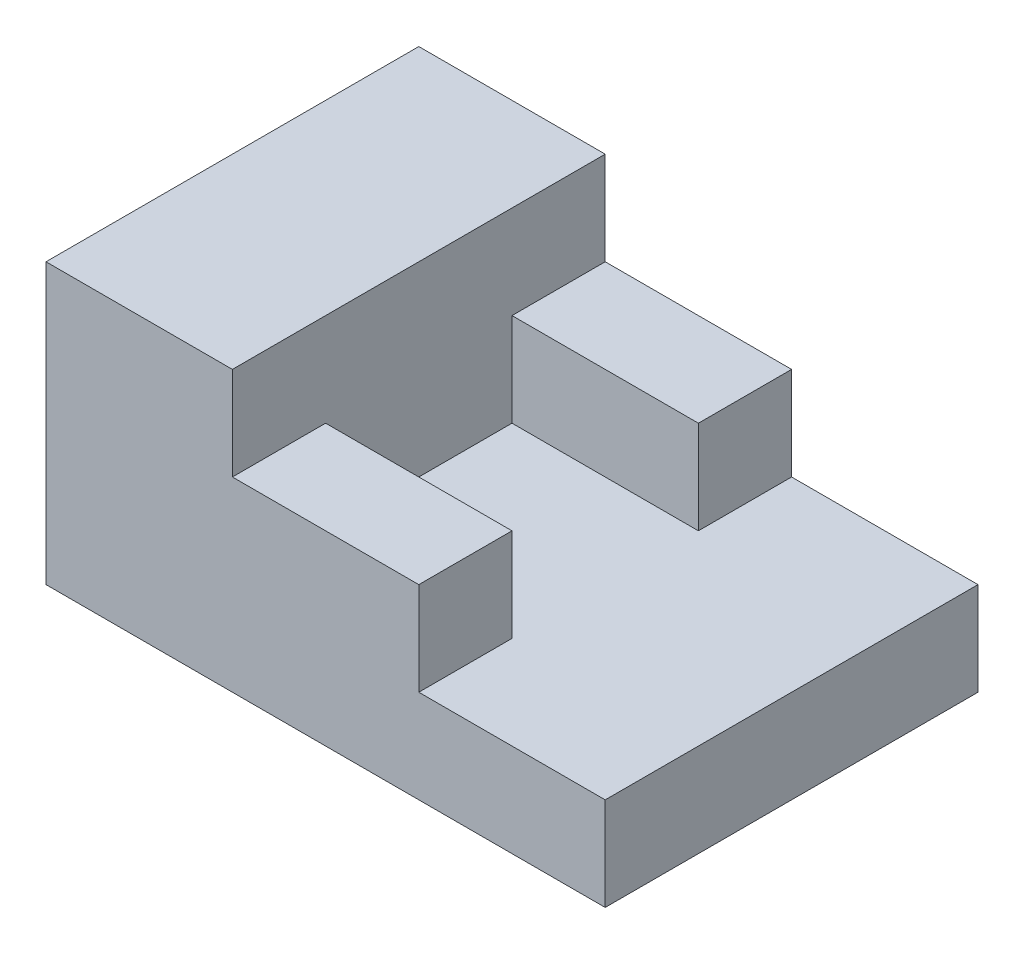
ISO-10303-21;
HEADER;
FILE_DESCRIPTION(('STEP AP214'),'2;1');
FILE_NAME('part.step','',(''),(''),'','','');
FILE_SCHEMA(('AUTOMOTIVE_DESIGN { 1 0 10303 214 1 1 1 1 }'));
ENDSEC;
DATA;
#1=APPLICATION_CONTEXT('core data for automotive mechanical design processes');
#2=APPLICATION_PROTOCOL_DEFINITION('international standard','automotive_design',2000,#1);
#3=PRODUCT_CONTEXT('',#1,'mechanical');
#4=PRODUCT('Part','Part','',(#3));
#5=PRODUCT_RELATED_PRODUCT_CATEGORY('part','',(#4));
#6=PRODUCT_DEFINITION_FORMATION('','',#4);
#7=PRODUCT_DEFINITION_CONTEXT('part definition',#1,'design');
#8=PRODUCT_DEFINITION('design','',#6,#7);
#9=PRODUCT_DEFINITION_SHAPE('','',#8);
#10=(LENGTH_UNIT() NAMED_UNIT(*) SI_UNIT(.MILLI.,.METRE.));
#11=(NAMED_UNIT(*) PLANE_ANGLE_UNIT() SI_UNIT($,.RADIAN.));
#12=(NAMED_UNIT(*) SI_UNIT($,.STERADIAN.) SOLID_ANGLE_UNIT());
#13=UNCERTAINTY_MEASURE_WITH_UNIT(LENGTH_MEASURE(1.E-05),#10,'distance_accuracy_value','');
#14=(GEOMETRIC_REPRESENTATION_CONTEXT(3) GLOBAL_UNCERTAINTY_ASSIGNED_CONTEXT((#13)) GLOBAL_UNIT_ASSIGNED_CONTEXT((#10,
#11,#12)) REPRESENTATION_CONTEXT('',''));
#15=CARTESIAN_POINT('',(0.,0.,0.));
#16=DIRECTION('',(0.,0.,1.));
#17=DIRECTION('',(1.,0.,0.));
#18=AXIS2_PLACEMENT_3D('',#15,#16,#17);
#19=CARTESIAN_POINT('',(2.71604938271606,-4.32098765432099,40.));
#20=DIRECTION('',(-1.,0.,0.));
#21=DIRECTION('',(0.,-1.,0.));
#22=AXIS2_PLACEMENT_3D('',#19,#20,#21);
#23=PLANE('',#22);
#24=DIRECTION('',(0.,1.,0.));
#25=VECTOR('',#24,1.);
#26=CARTESIAN_POINT('',(2.71604938271606,-4.32098765432099,30.));
#27=LINE('',#26,#25);
#28=CARTESIAN_POINT('',(2.71604938271606,-4.32098765432099,30.));
#29=VERTEX_POINT('',#28);
#30=CARTESIAN_POINT('',(2.71604938271606,5.67901234567901,30.));
#31=VERTEX_POINT('',#30);
#32=EDGE_CURVE('E138',#29,#31,#27,.T.);
#33=ORIENTED_EDGE('',*,*,#32,.T.);
#34=DIRECTION('',(0.,0.,-1.));
#35=VECTOR('',#34,1.);
#36=CARTESIAN_POINT('',(2.71604938271606,5.67901234567901,40.));
#37=LINE('',#36,#35);
#38=CARTESIAN_POINT('',(2.71604938271606,5.67901234567901,40.));
#39=VERTEX_POINT('',#38);
#40=EDGE_CURVE('E135',#39,#31,#37,.T.);
#41=ORIENTED_EDGE('',*,*,#40,.F.);
#42=DIRECTION('',(0.,1.,0.));
#43=VECTOR('',#42,1.);
#44=CARTESIAN_POINT('',(2.71604938271606,-4.32098765432099,40.));
#45=LINE('',#44,#43);
#46=CARTESIAN_POINT('',(2.71604938271606,-4.32098765432099,40.));
#47=VERTEX_POINT('',#46);
#48=EDGE_CURVE('E120',#47,#39,#45,.T.);
#49=ORIENTED_EDGE('',*,*,#48,.F.);
#50=DIRECTION('',(0.,0.,-1.));
#51=VECTOR('',#50,1.);
#52=CARTESIAN_POINT('',(2.71604938271606,-4.32098765432099,40.));
#53=LINE('',#52,#51);
#54=EDGE_CURVE('E188',#47,#29,#53,.T.);
#55=ORIENTED_EDGE('',*,*,#54,.T.);
#56=EDGE_LOOP('',(#33,#41,#49,#55));
#57=FACE_BOUND('',#56,.T.);
#58=ADVANCED_FACE('F39',(#57),#23,.F.);
#59=DIRECTION('',(0.,1.,0.));
#60=VECTOR('',#59,1.);
#61=CARTESIAN_POINT('',(2.71604938271606,-4.32098765432099,10.));
#62=LINE('',#61,#60);
#63=CARTESIAN_POINT('',(2.71604938271606,-4.32098765432099,10.));
#64=VERTEX_POINT('',#63);
#65=CARTESIAN_POINT('',(2.71604938271606,5.67901234567901,10.));
#66=VERTEX_POINT('',#65);
#67=EDGE_CURVE('E240',#64,#66,#62,.T.);
#68=ORIENTED_EDGE('',*,*,#67,.F.);
#69=CARTESIAN_POINT('',(2.71604938271606,-4.32098765432099,0.));
#70=VERTEX_POINT('',#69);
#71=EDGE_CURVE('E142',#64,#70,#53,.T.);
#72=ORIENTED_EDGE('',*,*,#71,.T.);
#73=DIRECTION('',(0.,1.,0.));
#74=VECTOR('',#73,1.);
#75=CARTESIAN_POINT('',(2.71604938271606,-4.32098765432099,0.));
#76=LINE('',#75,#74);
#77=CARTESIAN_POINT('',(2.71604938271606,5.67901234567901,0.));
#78=VERTEX_POINT('',#77);
#79=EDGE_CURVE('E172',#70,#78,#76,.T.);
#80=ORIENTED_EDGE('',*,*,#79,.T.);
#81=EDGE_CURVE('E143',#66,#78,#37,.T.);
#82=ORIENTED_EDGE('',*,*,#81,.F.);
#83=EDGE_LOOP('',(#68,#72,#80,#82));
#84=FACE_BOUND('',#83,.T.);
#85=ADVANCED_FACE('F277',(#84),#23,.F.);
#86=CARTESIAN_POINT('',(2.71604938271606,5.67901234567901,40.));
#87=DIRECTION('',(0.,-1.,0.));
#88=DIRECTION('',(1.,0.,0.));
#89=AXIS2_PLACEMENT_3D('',#86,#87,#88);
#90=PLANE('',#89);
#91=DIRECTION('',(-1.,0.,0.));
#92=VECTOR('',#91,1.);
#93=CARTESIAN_POINT('',(2.71604938271606,5.67901234567901,30.));
#94=LINE('',#93,#92);
#95=CARTESIAN_POINT('',(-17.2839506172839,5.67901234567901,30.));
#96=VERTEX_POINT('',#95);
#97=EDGE_CURVE('E247',#31,#96,#94,.T.);
#98=ORIENTED_EDGE('',*,*,#97,.T.);
#99=DIRECTION('',(0.,0.,-1.));
#100=VECTOR('',#99,1.);
#101=CARTESIAN_POINT('',(-17.2839506172839,5.67901234567901,40.));
#102=LINE('',#101,#100);
#103=CARTESIAN_POINT('',(-17.2839506172839,5.67901234567901,40.));
#104=VERTEX_POINT('',#103);
#105=EDGE_CURVE('E147',#104,#96,#102,.T.);
#106=ORIENTED_EDGE('',*,*,#105,.F.);
#107=DIRECTION('',(-1.,0.,0.));
#108=VECTOR('',#107,1.);
#109=CARTESIAN_POINT('',(2.71604938271606,5.67901234567901,40.));
#110=LINE('',#109,#108);
#111=EDGE_CURVE('E124',#39,#104,#110,.T.);
#112=ORIENTED_EDGE('',*,*,#111,.F.);
#113=ORIENTED_EDGE('',*,*,#40,.T.);
#114=EDGE_LOOP('',(#98,#106,#112,#113));
#115=FACE_BOUND('',#114,.T.);
#116=ADVANCED_FACE('F145',(#115),#90,.F.);
#117=DIRECTION('',(1.,0.,0.));
#118=VECTOR('',#117,1.);
#119=CARTESIAN_POINT('',(-17.2839506172839,5.67901234567901,10.));
#120=LINE('',#119,#118);
#121=CARTESIAN_POINT('',(-17.2839506172839,5.67901234567901,10.));
#122=VERTEX_POINT('',#121);
#123=EDGE_CURVE('E55',#122,#66,#120,.T.);
#124=ORIENTED_EDGE('',*,*,#123,.T.);
#125=ORIENTED_EDGE('',*,*,#81,.T.);
#126=DIRECTION('',(-1.,0.,0.));
#127=VECTOR('',#126,1.);
#128=CARTESIAN_POINT('',(2.71604938271606,5.67901234567901,0.));
#129=LINE('',#128,#127);
#130=CARTESIAN_POINT('',(-17.2839506172839,5.67901234567901,0.));
#131=VERTEX_POINT('',#130);
#132=EDGE_CURVE('E176',#78,#131,#129,.T.);
#133=ORIENTED_EDGE('',*,*,#132,.T.);
#134=EDGE_CURVE('E185',#122,#131,#102,.T.);
#135=ORIENTED_EDGE('',*,*,#134,.F.);
#136=EDGE_LOOP('',(#124,#125,#133,#135));
#137=FACE_BOUND('',#136,.T.);
#138=ADVANCED_FACE('F284',(#137),#90,.F.);
#139=CARTESIAN_POINT('',(-17.2839506172839,15.679012345679,40.));
#140=DIRECTION('',(0.,-1.,0.));
#141=DIRECTION('',(1.,0.,0.));
#142=AXIS2_PLACEMENT_3D('',#139,#140,#141);
#143=PLANE('',#142);
#144=DIRECTION('',(-1.,0.,0.));
#145=VECTOR('',#144,1.);
#146=CARTESIAN_POINT('',(-17.2839506172839,15.679012345679,0.));
#147=LINE('',#146,#145);
#148=CARTESIAN_POINT('',(-17.2839506172839,15.679012345679,0.));
#149=VERTEX_POINT('',#148);
#150=CARTESIAN_POINT('',(-37.2839506172839,15.679012345679,0.));
#151=VERTEX_POINT('',#150);
#152=EDGE_CURVE('E155',#149,#151,#147,.T.);
#153=ORIENTED_EDGE('',*,*,#152,.T.);
#154=DIRECTION('',(0.,0.,-1.));
#155=VECTOR('',#154,1.);
#156=CARTESIAN_POINT('',(-37.2839506172839,15.679012345679,40.));
#157=LINE('',#156,#155);
#158=CARTESIAN_POINT('',(-37.2839506172839,15.679012345679,40.));
#159=VERTEX_POINT('',#158);
#160=EDGE_CURVE('E11',#159,#151,#157,.T.);
#161=ORIENTED_EDGE('',*,*,#160,.F.);
#162=DIRECTION('',(-1.,0.,0.));
#163=VECTOR('',#162,1.);
#164=CARTESIAN_POINT('',(-17.2839506172839,15.679012345679,40.));
#165=LINE('',#164,#163);
#166=CARTESIAN_POINT('',(-17.2839506172839,15.679012345679,40.));
#167=VERTEX_POINT('',#166);
#168=EDGE_CURVE('E182',#167,#159,#165,.T.);
#169=ORIENTED_EDGE('',*,*,#168,.F.);
#170=DIRECTION('',(0.,0.,-1.));
#171=VECTOR('',#170,1.);
#172=CARTESIAN_POINT('',(-17.2839506172839,15.679012345679,40.));
#173=LINE('',#172,#171);
#174=EDGE_CURVE('E151',#167,#149,#173,.T.);
#175=ORIENTED_EDGE('',*,*,#174,.T.);
#176=EDGE_LOOP('',(#153,#161,#169,#175));
#177=FACE_BOUND('',#176,.T.);
#178=ADVANCED_FACE('F41',(#177),#143,.F.);
#179=CARTESIAN_POINT('',(-37.2839506172839,15.679012345679,40.));
#180=DIRECTION('',(1.,0.,0.));
#181=DIRECTION('',(0.,0.,-1.));
#182=AXIS2_PLACEMENT_3D('',#179,#180,#181);
#183=PLANE('',#182);
#184=DIRECTION('',(0.,-1.,0.));
#185=VECTOR('',#184,1.);
#186=CARTESIAN_POINT('',(-37.2839506172839,15.679012345679,0.));
#187=LINE('',#186,#185);
#188=CARTESIAN_POINT('',(-37.2839506172839,-14.320987654321,0.));
#189=VERTEX_POINT('',#188);
#190=EDGE_CURVE('E159',#151,#189,#187,.T.);
#191=ORIENTED_EDGE('',*,*,#190,.T.);
#192=DIRECTION('',(0.,0.,-1.));
#193=VECTOR('',#192,1.);
#194=CARTESIAN_POINT('',(-37.2839506172839,-14.320987654321,40.));
#195=LINE('',#194,#193);
#196=CARTESIAN_POINT('',(-37.2839506172839,-14.320987654321,40.));
#197=VERTEX_POINT('',#196);
#198=EDGE_CURVE('E48',#197,#189,#195,.T.);
#199=ORIENTED_EDGE('',*,*,#198,.F.);
#200=DIRECTION('',(0.,-1.,0.));
#201=VECTOR('',#200,1.);
#202=CARTESIAN_POINT('',(-37.2839506172839,15.679012345679,40.));
#203=LINE('',#202,#201);
#204=EDGE_CURVE('E104',#159,#197,#203,.T.);
#205=ORIENTED_EDGE('',*,*,#204,.F.);
#206=ORIENTED_EDGE('',*,*,#160,.T.);
#207=EDGE_LOOP('',(#191,#199,#205,#206));
#208=FACE_BOUND('',#207,.T.);
#209=ADVANCED_FACE('F288',(#208),#183,.F.);
#210=CARTESIAN_POINT('',(-37.2839506172839,-14.320987654321,40.));
#211=DIRECTION('',(0.,1.,0.));
#212=DIRECTION('',(-1.,0.,0.));
#213=AXIS2_PLACEMENT_3D('',#210,#211,#212);
#214=PLANE('',#213);
#215=DIRECTION('',(1.,0.,0.));
#216=VECTOR('',#215,1.);
#217=CARTESIAN_POINT('',(-37.2839506172839,-14.320987654321,0.));
#218=LINE('',#217,#216);
#219=CARTESIAN_POINT('',(22.7160493827161,-14.320987654321,0.));
#220=VERTEX_POINT('',#219);
#221=EDGE_CURVE('E162',#189,#220,#218,.T.);
#222=ORIENTED_EDGE('',*,*,#221,.T.);
#223=DIRECTION('',(0.,0.,-1.));
#224=VECTOR('',#223,1.);
#225=CARTESIAN_POINT('',(22.7160493827161,-14.320987654321,40.));
#226=LINE('',#225,#224);
#227=CARTESIAN_POINT('',(22.7160493827161,-14.320987654321,40.));
#228=VERTEX_POINT('',#227);
#229=EDGE_CURVE('E195',#228,#220,#226,.T.);
#230=ORIENTED_EDGE('',*,*,#229,.F.);
#231=DIRECTION('',(1.,0.,0.));
#232=VECTOR('',#231,1.);
#233=CARTESIAN_POINT('',(-37.2839506172839,-14.320987654321,40.));
#234=LINE('',#233,#232);
#235=EDGE_CURVE('E205',#197,#228,#234,.T.);
#236=ORIENTED_EDGE('',*,*,#235,.F.);
#237=ORIENTED_EDGE('',*,*,#198,.T.);
#238=EDGE_LOOP('',(#222,#230,#236,#237));
#239=FACE_BOUND('',#238,.T.);
#240=ADVANCED_FACE('F203',(#239),#214,.F.);
#241=CARTESIAN_POINT('',(22.7160493827161,-14.320987654321,40.));
#242=DIRECTION('',(-1.,0.,0.));
#243=DIRECTION('',(0.,0.,1.));
#244=AXIS2_PLACEMENT_3D('',#241,#242,#243);
#245=PLANE('',#244);
#246=DIRECTION('',(0.,1.,0.));
#247=VECTOR('',#246,1.);
#248=CARTESIAN_POINT('',(22.7160493827161,-14.320987654321,0.));
#249=LINE('',#248,#247);
#250=CARTESIAN_POINT('',(22.7160493827161,-4.32098765432098,0.));
#251=VERTEX_POINT('',#250);
#252=EDGE_CURVE('E165',#220,#251,#249,.T.);
#253=ORIENTED_EDGE('',*,*,#252,.T.);
#254=DIRECTION('',(0.,0.,-1.));
#255=VECTOR('',#254,1.);
#256=CARTESIAN_POINT('',(22.7160493827161,-4.32098765432098,40.));
#257=LINE('',#256,#255);
#258=CARTESIAN_POINT('',(22.7160493827161,-4.32098765432098,40.));
#259=VERTEX_POINT('',#258);
#260=EDGE_CURVE('E191',#259,#251,#257,.T.);
#261=ORIENTED_EDGE('',*,*,#260,.F.);
#262=DIRECTION('',(0.,1.,0.));
#263=VECTOR('',#262,1.);
#264=CARTESIAN_POINT('',(22.7160493827161,-14.320987654321,40.));
#265=LINE('',#264,#263);
#266=EDGE_CURVE('E221',#228,#259,#265,.T.);
#267=ORIENTED_EDGE('',*,*,#266,.F.);
#268=ORIENTED_EDGE('',*,*,#229,.T.);
#269=EDGE_LOOP('',(#253,#261,#267,#268));
#270=FACE_BOUND('',#269,.T.);
#271=ADVANCED_FACE('F214',(#270),#245,.F.);
#272=CARTESIAN_POINT('',(22.7160493827161,-4.32098765432098,40.));
#273=DIRECTION('',(0.,-1.,0.));
#274=DIRECTION('',(1.,0.,0.));
#275=AXIS2_PLACEMENT_3D('',#272,#273,#274);
#276=PLANE('',#275);
#277=DIRECTION('',(-1.,0.,0.));
#278=VECTOR('',#277,1.);
#279=CARTESIAN_POINT('',(22.7160493827161,-4.32098765432098,0.));
#280=LINE('',#279,#278);
#281=EDGE_CURVE('E168',#251,#70,#280,.T.);
#282=ORIENTED_EDGE('',*,*,#281,.T.);
#283=ORIENTED_EDGE('',*,*,#71,.F.);
#284=DIRECTION('',(1.,0.,0.));
#285=VECTOR('',#284,1.);
#286=CARTESIAN_POINT('',(-17.2839506172839,-4.32098765432099,10.));
#287=LINE('',#286,#285);
#288=CARTESIAN_POINT('',(-17.2839506172839,-4.32098765432099,10.));
#289=VERTEX_POINT('',#288);
#290=EDGE_CURVE('E243',#289,#64,#287,.T.);
#291=ORIENTED_EDGE('',*,*,#290,.F.);
#292=DIRECTION('',(0.,0.,-1.));
#293=VECTOR('',#292,1.);
#294=CARTESIAN_POINT('',(-17.2839506172839,-4.32098765432099,30.));
#295=LINE('',#294,#293);
#296=CARTESIAN_POINT('',(-17.2839506172839,-4.32098765432099,30.));
#297=VERTEX_POINT('',#296);
#298=EDGE_CURVE('E253',#297,#289,#295,.T.);
#299=ORIENTED_EDGE('',*,*,#298,.F.);
#300=DIRECTION('',(-1.,0.,0.));
#301=VECTOR('',#300,1.);
#302=CARTESIAN_POINT('',(2.71604938271606,-4.32098765432099,30.));
#303=LINE('',#302,#301);
#304=EDGE_CURVE('E246',#29,#297,#303,.T.);
#305=ORIENTED_EDGE('',*,*,#304,.F.);
#306=ORIENTED_EDGE('',*,*,#54,.F.);
#307=DIRECTION('',(-1.,0.,0.));
#308=VECTOR('',#307,1.);
#309=CARTESIAN_POINT('',(22.7160493827161,-4.32098765432098,40.));
#310=LINE('',#309,#308);
#311=EDGE_CURVE('E127',#259,#47,#310,.T.);
#312=ORIENTED_EDGE('',*,*,#311,.F.);
#313=ORIENTED_EDGE('',*,*,#260,.T.);
#314=EDGE_LOOP('',(#282,#283,#291,#299,#305,#306,#312,#313));
#315=FACE_BOUND('',#314,.T.);
#316=ADVANCED_FACE('F217',(#315),#276,.F.);
#317=CARTESIAN_POINT('',(-17.2839506172839,5.67901234567901,40.));
#318=DIRECTION('',(-1.,0.,0.));
#319=DIRECTION('',(0.,0.,1.));
#320=AXIS2_PLACEMENT_3D('',#317,#318,#319);
#321=PLANE('',#320);
#322=DIRECTION('',(0.,1.,0.));
#323=VECTOR('',#322,1.);
#324=CARTESIAN_POINT('',(-17.2839506172839,5.67901234567901,0.));
#325=LINE('',#324,#323);
#326=EDGE_CURVE('E96',#131,#149,#325,.T.);
#327=ORIENTED_EDGE('',*,*,#326,.T.);
#328=ORIENTED_EDGE('',*,*,#174,.F.);
#329=DIRECTION('',(0.,1.,0.));
#330=VECTOR('',#329,1.);
#331=CARTESIAN_POINT('',(-17.2839506172839,5.67901234567901,40.));
#332=LINE('',#331,#330);
#333=EDGE_CURVE('E64',#104,#167,#332,.T.);
#334=ORIENTED_EDGE('',*,*,#333,.F.);
#335=ORIENTED_EDGE('',*,*,#105,.T.);
#336=DIRECTION('',(0.,1.,0.));
#337=VECTOR('',#336,1.);
#338=CARTESIAN_POINT('',(-17.2839506172839,-4.32098765432099,30.));
#339=LINE('',#338,#337);
#340=EDGE_CURVE('E233',#297,#96,#339,.T.);
#341=ORIENTED_EDGE('',*,*,#340,.F.);
#342=ORIENTED_EDGE('',*,*,#298,.T.);
#343=DIRECTION('',(0.,1.,0.));
#344=VECTOR('',#343,1.);
#345=CARTESIAN_POINT('',(-17.2839506172839,-4.32098765432099,10.));
#346=LINE('',#345,#344);
#347=EDGE_CURVE('E237',#289,#122,#346,.T.);
#348=ORIENTED_EDGE('',*,*,#347,.T.);
#349=ORIENTED_EDGE('',*,*,#134,.T.);
#350=EDGE_LOOP('',(#327,#328,#334,#335,#341,#342,#348,#349));
#351=FACE_BOUND('',#350,.T.);
#352=ADVANCED_FACE('F269',(#351),#321,.F.);
#353=CARTESIAN_POINT('',(0.,0.,40.));
#354=DIRECTION('',(0.,0.,1.));
#355=DIRECTION('',(1.,0.,0.));
#356=AXIS2_PLACEMENT_3D('',#353,#354,#355);
#357=PLANE('',#356);
#358=ORIENTED_EDGE('',*,*,#168,.T.);
#359=ORIENTED_EDGE('',*,*,#204,.T.);
#360=ORIENTED_EDGE('',*,*,#235,.T.);
#361=ORIENTED_EDGE('',*,*,#266,.T.);
#362=ORIENTED_EDGE('',*,*,#311,.T.);
#363=ORIENTED_EDGE('',*,*,#48,.T.);
#364=ORIENTED_EDGE('',*,*,#111,.T.);
#365=ORIENTED_EDGE('',*,*,#333,.T.);
#366=EDGE_LOOP('',(#358,#359,#360,#361,#362,#363,#364,#365));
#367=FACE_BOUND('',#366,.T.);
#368=ADVANCED_FACE('F122',(#367),#357,.T.);
#369=CARTESIAN_POINT('',(0.,0.,0.));
#370=DIRECTION('',(0.,0.,1.));
#371=DIRECTION('',(1.,0.,0.));
#372=AXIS2_PLACEMENT_3D('',#369,#370,#371);
#373=PLANE('',#372);
#374=ORIENTED_EDGE('',*,*,#152,.F.);
#375=ORIENTED_EDGE('',*,*,#326,.F.);
#376=ORIENTED_EDGE('',*,*,#132,.F.);
#377=ORIENTED_EDGE('',*,*,#79,.F.);
#378=ORIENTED_EDGE('',*,*,#281,.F.);
#379=ORIENTED_EDGE('',*,*,#252,.F.);
#380=ORIENTED_EDGE('',*,*,#221,.F.);
#381=ORIENTED_EDGE('',*,*,#190,.F.);
#382=EDGE_LOOP('',(#374,#375,#376,#377,#378,#379,#380,#381));
#383=FACE_BOUND('',#382,.T.);
#384=ADVANCED_FACE('F209',(#383),#373,.F.);
#385=CARTESIAN_POINT('',(2.71604938271606,-4.32098765432099,30.));
#386=DIRECTION('',(0.,0.,-1.));
#387=DIRECTION('',(-1.,0.,0.));
#388=AXIS2_PLACEMENT_3D('',#385,#386,#387);
#389=PLANE('',#388);
#390=ORIENTED_EDGE('',*,*,#97,.F.);
#391=ORIENTED_EDGE('',*,*,#32,.F.);
#392=ORIENTED_EDGE('',*,*,#304,.T.);
#393=ORIENTED_EDGE('',*,*,#340,.T.);
#394=EDGE_LOOP('',(#390,#391,#392,#393));
#395=FACE_BOUND('',#394,.T.);
#396=ADVANCED_FACE('F263',(#395),#389,.T.);
#397=CARTESIAN_POINT('',(-17.2839506172839,-4.32098765432099,10.));
#398=DIRECTION('',(0.,0.,1.));
#399=DIRECTION('',(1.,0.,0.));
#400=AXIS2_PLACEMENT_3D('',#397,#398,#399);
#401=PLANE('',#400);
#402=ORIENTED_EDGE('',*,*,#123,.F.);
#403=ORIENTED_EDGE('',*,*,#347,.F.);
#404=ORIENTED_EDGE('',*,*,#290,.T.);
#405=ORIENTED_EDGE('',*,*,#67,.T.);
#406=EDGE_LOOP('',(#402,#403,#404,#405));
#407=FACE_BOUND('',#406,.T.);
#408=ADVANCED_FACE('F273',(#407),#401,.T.);
#409=CLOSED_SHELL('',(#58,#85,#116,#138,#178,#209,#240,#271,#316,#352,#368,#384,#396,#408));
#410=MANIFOLD_SOLID_BREP('B2',#409);
#411=ADVANCED_BREP_SHAPE_REPRESENTATION('',(#18,#410),#14);
#412=SHAPE_DEFINITION_REPRESENTATION(#9,#411);
ENDSEC;
END-ISO-10303-21;
